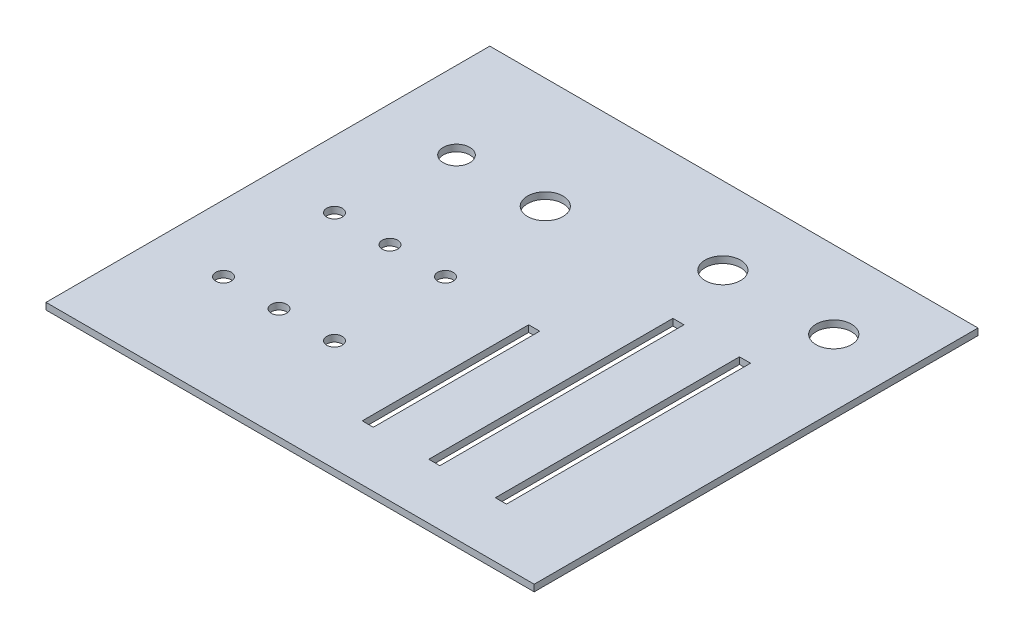
ISO-10303-21;
HEADER;
FILE_DESCRIPTION(('STEP AP214'),'2;1');
FILE_NAME('part.step','',(''),(''),'','','');
FILE_SCHEMA(('AUTOMOTIVE_DESIGN { 1 0 10303 214 1 1 1 1 }'));
ENDSEC;
DATA;
#1=APPLICATION_CONTEXT('core data for automotive mechanical design processes');
#2=APPLICATION_PROTOCOL_DEFINITION('international standard','automotive_design',2000,#1);
#3=PRODUCT_CONTEXT('',#1,'mechanical');
#4=PRODUCT('Part','Part','',(#3));
#5=PRODUCT_RELATED_PRODUCT_CATEGORY('part','',(#4));
#6=PRODUCT_DEFINITION_FORMATION('','',#4);
#7=PRODUCT_DEFINITION_CONTEXT('part definition',#1,'design');
#8=PRODUCT_DEFINITION('design','',#6,#7);
#9=PRODUCT_DEFINITION_SHAPE('','',#8);
#10=(LENGTH_UNIT() NAMED_UNIT(*) SI_UNIT(.MILLI.,.METRE.));
#11=(NAMED_UNIT(*) PLANE_ANGLE_UNIT() SI_UNIT($,.RADIAN.));
#12=(NAMED_UNIT(*) SI_UNIT($,.STERADIAN.) SOLID_ANGLE_UNIT());
#13=UNCERTAINTY_MEASURE_WITH_UNIT(LENGTH_MEASURE(1.E-05),#10,'distance_accuracy_value','');
#14=(GEOMETRIC_REPRESENTATION_CONTEXT(3) GLOBAL_UNCERTAINTY_ASSIGNED_CONTEXT((#13)) GLOBAL_UNIT_ASSIGNED_CONTEXT((#10,
#11,#12)) REPRESENTATION_CONTEXT('',''));
#15=CARTESIAN_POINT('',(0.,0.,0.));
#16=DIRECTION('',(0.,0.,1.));
#17=DIRECTION('',(1.,0.,0.));
#18=AXIS2_PLACEMENT_3D('',#15,#16,#17);
#19=CARTESIAN_POINT('',(-110.,3.,-100.));
#20=DIRECTION('',(1.,0.,0.));
#21=DIRECTION('',(0.,0.,-1.));
#22=AXIS2_PLACEMENT_3D('',#19,#20,#21);
#23=PLANE('',#22);
#24=DIRECTION('',(0.,0.,1.));
#25=VECTOR('',#24,1.);
#26=CARTESIAN_POINT('',(-110.,0.,-100.));
#27=LINE('',#26,#25);
#28=CARTESIAN_POINT('',(-110.,0.,-100.));
#29=VERTEX_POINT('',#28);
#30=CARTESIAN_POINT('',(-110.,0.,100.));
#31=VERTEX_POINT('',#30);
#32=EDGE_CURVE('E302',#29,#31,#27,.T.);
#33=ORIENTED_EDGE('',*,*,#32,.T.);
#34=DIRECTION('',(0.,-1.,0.));
#35=VECTOR('',#34,1.);
#36=CARTESIAN_POINT('',(-110.,3.,100.));
#37=LINE('',#36,#35);
#38=CARTESIAN_POINT('',(-110.,3.,100.));
#39=VERTEX_POINT('',#38);
#40=EDGE_CURVE('E11',#39,#31,#37,.T.);
#41=ORIENTED_EDGE('',*,*,#40,.F.);
#42=DIRECTION('',(0.,0.,1.));
#43=VECTOR('',#42,1.);
#44=CARTESIAN_POINT('',(-110.,3.,-100.));
#45=LINE('',#44,#43);
#46=CARTESIAN_POINT('',(-110.,3.,-100.));
#47=VERTEX_POINT('',#46);
#48=EDGE_CURVE('E305',#47,#39,#45,.T.);
#49=ORIENTED_EDGE('',*,*,#48,.F.);
#50=DIRECTION('',(0.,-1.,0.));
#51=VECTOR('',#50,1.);
#52=CARTESIAN_POINT('',(-110.,3.,-100.));
#53=LINE('',#52,#51);
#54=EDGE_CURVE('E315',#47,#29,#53,.T.);
#55=ORIENTED_EDGE('',*,*,#54,.T.);
#56=EDGE_LOOP('',(#33,#41,#49,#55));
#57=FACE_BOUND('',#56,.T.);
#58=ADVANCED_FACE('F33',(#57),#23,.F.);
#59=CARTESIAN_POINT('',(110.,3.,100.));
#60=DIRECTION('',(0.,0.,-1.));
#61=DIRECTION('',(-1.,0.,0.));
#62=AXIS2_PLACEMENT_3D('',#59,#60,#61);
#63=PLANE('',#62);
#64=DIRECTION('',(1.,0.,0.));
#65=VECTOR('',#64,1.);
#66=CARTESIAN_POINT('',(110.,0.,100.));
#67=LINE('',#66,#65);
#68=CARTESIAN_POINT('',(110.,0.,100.));
#69=VERTEX_POINT('',#68);
#70=EDGE_CURVE('E318',#31,#69,#67,.T.);
#71=ORIENTED_EDGE('',*,*,#70,.T.);
#72=DIRECTION('',(0.,-1.,0.));
#73=VECTOR('',#72,1.);
#74=CARTESIAN_POINT('',(110.,3.,100.));
#75=LINE('',#74,#73);
#76=CARTESIAN_POINT('',(110.,3.,100.));
#77=VERTEX_POINT('',#76);
#78=EDGE_CURVE('E40',#77,#69,#75,.T.);
#79=ORIENTED_EDGE('',*,*,#78,.F.);
#80=DIRECTION('',(1.,0.,0.));
#81=VECTOR('',#80,1.);
#82=CARTESIAN_POINT('',(110.,3.,100.));
#83=LINE('',#82,#81);
#84=EDGE_CURVE('E308',#39,#77,#83,.T.);
#85=ORIENTED_EDGE('',*,*,#84,.F.);
#86=ORIENTED_EDGE('',*,*,#40,.T.);
#87=EDGE_LOOP('',(#71,#79,#85,#86));
#88=FACE_BOUND('',#87,.T.);
#89=ADVANCED_FACE('F347',(#88),#63,.F.);
#90=CARTESIAN_POINT('',(110.,3.,-100.));
#91=DIRECTION('',(-1.,0.,0.));
#92=DIRECTION('',(0.,0.,1.));
#93=AXIS2_PLACEMENT_3D('',#90,#91,#92);
#94=PLANE('',#93);
#95=DIRECTION('',(0.,0.,-1.));
#96=VECTOR('',#95,1.);
#97=CARTESIAN_POINT('',(110.,0.,-100.));
#98=LINE('',#97,#96);
#99=CARTESIAN_POINT('',(110.,0.,-100.));
#100=VERTEX_POINT('',#99);
#101=EDGE_CURVE('E320',#69,#100,#98,.T.);
#102=ORIENTED_EDGE('',*,*,#101,.T.);
#103=DIRECTION('',(0.,-1.,0.));
#104=VECTOR('',#103,1.);
#105=CARTESIAN_POINT('',(110.,3.,-100.));
#106=LINE('',#105,#104);
#107=CARTESIAN_POINT('',(110.,3.,-100.));
#108=VERTEX_POINT('',#107);
#109=EDGE_CURVE('E325',#108,#100,#106,.T.);
#110=ORIENTED_EDGE('',*,*,#109,.F.);
#111=DIRECTION('',(0.,0.,-1.));
#112=VECTOR('',#111,1.);
#113=CARTESIAN_POINT('',(110.,3.,-100.));
#114=LINE('',#113,#112);
#115=EDGE_CURVE('E311',#77,#108,#114,.T.);
#116=ORIENTED_EDGE('',*,*,#115,.F.);
#117=ORIENTED_EDGE('',*,*,#78,.T.);
#118=EDGE_LOOP('',(#102,#110,#116,#117));
#119=FACE_BOUND('',#118,.T.);
#120=ADVANCED_FACE('F332',(#119),#94,.F.);
#121=CARTESIAN_POINT('',(110.,3.,-100.));
#122=DIRECTION('',(0.,0.,1.));
#123=DIRECTION('',(1.,0.,0.));
#124=AXIS2_PLACEMENT_3D('',#121,#122,#123);
#125=PLANE('',#124);
#126=DIRECTION('',(-1.,0.,0.));
#127=VECTOR('',#126,1.);
#128=CARTESIAN_POINT('',(110.,0.,-100.));
#129=LINE('',#128,#127);
#130=EDGE_CURVE('E309',#100,#29,#129,.T.);
#131=ORIENTED_EDGE('',*,*,#130,.T.);
#132=ORIENTED_EDGE('',*,*,#54,.F.);
#133=DIRECTION('',(-1.,0.,0.));
#134=VECTOR('',#133,1.);
#135=CARTESIAN_POINT('',(110.,3.,-100.));
#136=LINE('',#135,#134);
#137=EDGE_CURVE('E313',#108,#47,#136,.T.);
#138=ORIENTED_EDGE('',*,*,#137,.F.);
#139=ORIENTED_EDGE('',*,*,#109,.T.);
#140=EDGE_LOOP('',(#131,#132,#138,#139));
#141=FACE_BOUND('',#140,.T.);
#142=ADVANCED_FACE('F340',(#141),#125,.F.);
#143=CARTESIAN_POINT('',(0.,3.,0.));
#144=DIRECTION('',(0.,-1.,0.));
#145=DIRECTION('',(0.,0.,-1.));
#146=AXIS2_PLACEMENT_3D('',#143,#144,#145);
#147=PLANE('',#146);
#148=CARTESIAN_POINT('',(-29.9999999999999,3.,50.));
#149=DIRECTION('',(0.,1.,0.));
#150=DIRECTION('',(0.,0.,1.));
#151=AXIS2_PLACEMENT_3D('',#148,#149,#150);
#152=CIRCLE('',#151,3.5);
#153=CARTESIAN_POINT('',(-29.9999999999999,3.,53.5));
#154=VERTEX_POINT('',#153);
#155=EDGE_CURVE('E267',#154,#154,#152,.T.);
#156=ORIENTED_EDGE('',*,*,#155,.F.);
#157=EDGE_LOOP('',(#156));
#158=FACE_BOUND('',#157,.T.);
#159=CARTESIAN_POINT('',(-75.,3.,-50.));
#160=DIRECTION('',(0.,1.,0.));
#161=DIRECTION('',(0.,0.,1.));
#162=AXIS2_PLACEMENT_3D('',#159,#160,#161);
#163=CIRCLE('',#162,6.);
#164=CARTESIAN_POINT('',(-75.,3.,-44.));
#165=VERTEX_POINT('',#164);
#166=EDGE_CURVE('E252',#165,#165,#163,.T.);
#167=ORIENTED_EDGE('',*,*,#166,.F.);
#168=EDGE_LOOP('',(#167));
#169=FACE_BOUND('',#168,.T.);
#170=CARTESIAN_POINT('',(-35.,3.,-50.));
#171=DIRECTION('',(0.,1.,0.));
#172=DIRECTION('',(0.,0.,1.));
#173=AXIS2_PLACEMENT_3D('',#170,#171,#172);
#174=CIRCLE('',#173,8.);
#175=CARTESIAN_POINT('',(-35.,3.,-42.));
#176=VERTEX_POINT('',#175);
#177=EDGE_CURVE('E253',#176,#176,#174,.T.);
#178=ORIENTED_EDGE('',*,*,#177,.F.);
#179=EDGE_LOOP('',(#178));
#180=FACE_BOUND('',#179,.T.);
#181=CARTESIAN_POINT('',(29.9999999999999,3.,-65.));
#182=DIRECTION('',(0.,1.,0.));
#183=DIRECTION('',(0.,0.,1.));
#184=AXIS2_PLACEMENT_3D('',#181,#182,#183);
#185=CIRCLE('',#184,8.);
#186=CARTESIAN_POINT('',(29.9999999999999,3.,-57.));
#187=VERTEX_POINT('',#186);
#188=EDGE_CURVE('E259',#187,#187,#185,.T.);
#189=ORIENTED_EDGE('',*,*,#188,.F.);
#190=EDGE_LOOP('',(#189));
#191=FACE_BOUND('',#190,.T.);
#192=CARTESIAN_POINT('',(-55.,3.,50.));
#193=DIRECTION('',(0.,1.,0.));
#194=DIRECTION('',(0.,0.,1.));
#195=AXIS2_PLACEMENT_3D('',#192,#193,#194);
#196=CIRCLE('',#195,3.5);
#197=CARTESIAN_POINT('',(-55.,3.,53.5));
#198=VERTEX_POINT('',#197);
#199=EDGE_CURVE('E266',#198,#198,#196,.T.);
#200=ORIENTED_EDGE('',*,*,#199,.F.);
#201=EDGE_LOOP('',(#200));
#202=FACE_BOUND('',#201,.T.);
#203=CARTESIAN_POINT('',(-79.9999999999999,3.,50.));
#204=DIRECTION('',(0.,1.,0.));
#205=DIRECTION('',(0.,0.,1.));
#206=AXIS2_PLACEMENT_3D('',#203,#204,#205);
#207=CIRCLE('',#206,3.50000000000001);
#208=CARTESIAN_POINT('',(-79.9999999999999,3.,53.5));
#209=VERTEX_POINT('',#208);
#210=EDGE_CURVE('E291',#209,#209,#207,.T.);
#211=ORIENTED_EDGE('',*,*,#210,.F.);
#212=EDGE_LOOP('',(#211));
#213=FACE_BOUND('',#212,.T.);
#214=CARTESIAN_POINT('',(-30.,3.,0.));
#215=DIRECTION('',(0.,1.,0.));
#216=DIRECTION('',(0.,0.,1.));
#217=AXIS2_PLACEMENT_3D('',#214,#215,#216);
#218=CIRCLE('',#217,3.5);
#219=CARTESIAN_POINT('',(-30.,3.,3.5));
#220=VERTEX_POINT('',#219);
#221=EDGE_CURVE('E285',#220,#220,#218,.T.);
#222=ORIENTED_EDGE('',*,*,#221,.F.);
#223=EDGE_LOOP('',(#222));
#224=FACE_BOUND('',#223,.T.);
#225=CARTESIAN_POINT('',(-55.,3.,0.));
#226=DIRECTION('',(0.,1.,0.));
#227=DIRECTION('',(0.,0.,1.));
#228=AXIS2_PLACEMENT_3D('',#225,#226,#227);
#229=CIRCLE('',#228,3.5);
#230=CARTESIAN_POINT('',(-55.,3.,3.50000000000001));
#231=VERTEX_POINT('',#230);
#232=EDGE_CURVE('E279',#231,#231,#229,.T.);
#233=ORIENTED_EDGE('',*,*,#232,.F.);
#234=EDGE_LOOP('',(#233));
#235=FACE_BOUND('',#234,.T.);
#236=CARTESIAN_POINT('',(79.9999999999999,3.,-65.));
#237=DIRECTION('',(0.,1.,0.));
#238=DIRECTION('',(0.,0.,1.));
#239=AXIS2_PLACEMENT_3D('',#236,#237,#238);
#240=CIRCLE('',#239,7.99999999999999);
#241=CARTESIAN_POINT('',(79.9999999999999,3.,-57.));
#242=VERTEX_POINT('',#241);
#243=EDGE_CURVE('E172',#242,#242,#240,.T.);
#244=ORIENTED_EDGE('',*,*,#243,.F.);
#245=EDGE_LOOP('',(#244));
#246=FACE_BOUND('',#245,.T.);
#247=DIRECTION('',(-1.,0.,0.));
#248=VECTOR('',#247,1.);
#249=CARTESIAN_POINT('',(67.4999999999999,3.,-35.));
#250=LINE('',#249,#248);
#251=CARTESIAN_POINT('',(72.5,3.,-35.));
#252=VERTEX_POINT('',#251);
#253=CARTESIAN_POINT('',(67.4999999999999,3.,-35.));
#254=VERTEX_POINT('',#253);
#255=EDGE_CURVE('E178',#252,#254,#250,.T.);
#256=ORIENTED_EDGE('',*,*,#255,.F.);
#257=DIRECTION('',(0.,0.,-1.));
#258=VECTOR('',#257,1.);
#259=CARTESIAN_POINT('',(72.5,3.,-35.));
#260=LINE('',#259,#258);
#261=CARTESIAN_POINT('',(72.5,3.,75.));
#262=VERTEX_POINT('',#261);
#263=EDGE_CURVE('E47',#262,#252,#260,.T.);
#264=ORIENTED_EDGE('',*,*,#263,.F.);
#265=DIRECTION('',(1.,0.,0.));
#266=VECTOR('',#265,1.);
#267=CARTESIAN_POINT('',(67.5,3.,75.));
#268=LINE('',#267,#266);
#269=CARTESIAN_POINT('',(67.5,3.,75.));
#270=VERTEX_POINT('',#269);
#271=EDGE_CURVE('E166',#270,#262,#268,.T.);
#272=ORIENTED_EDGE('',*,*,#271,.F.);
#273=DIRECTION('',(0.,0.,1.));
#274=VECTOR('',#273,1.);
#275=CARTESIAN_POINT('',(67.4999999999999,3.,-35.));
#276=LINE('',#275,#274);
#277=EDGE_CURVE('E169',#254,#270,#276,.T.);
#278=ORIENTED_EDGE('',*,*,#277,.F.);
#279=EDGE_LOOP('',(#256,#264,#272,#278));
#280=FACE_BOUND('',#279,.T.);
#281=DIRECTION('',(-1.,0.,0.));
#282=VECTOR('',#281,1.);
#283=CARTESIAN_POINT('',(37.5,3.,-35.));
#284=LINE('',#283,#282);
#285=CARTESIAN_POINT('',(42.5,3.,-35.));
#286=VERTEX_POINT('',#285);
#287=CARTESIAN_POINT('',(37.5,3.,-35.));
#288=VERTEX_POINT('',#287);
#289=EDGE_CURVE('E203',#286,#288,#284,.T.);
#290=ORIENTED_EDGE('',*,*,#289,.F.);
#291=DIRECTION('',(0.,0.,-1.));
#292=VECTOR('',#291,1.);
#293=CARTESIAN_POINT('',(42.5,3.,-35.));
#294=LINE('',#293,#292);
#295=CARTESIAN_POINT('',(42.5,3.,75.));
#296=VERTEX_POINT('',#295);
#297=EDGE_CURVE('E55',#296,#286,#294,.T.);
#298=ORIENTED_EDGE('',*,*,#297,.F.);
#299=DIRECTION('',(1.,0.,0.));
#300=VECTOR('',#299,1.);
#301=CARTESIAN_POINT('',(37.5,3.,75.));
#302=LINE('',#301,#300);
#303=CARTESIAN_POINT('',(37.5,3.,75.));
#304=VERTEX_POINT('',#303);
#305=EDGE_CURVE('E192',#304,#296,#302,.T.);
#306=ORIENTED_EDGE('',*,*,#305,.F.);
#307=DIRECTION('',(0.,0.,1.));
#308=VECTOR('',#307,1.);
#309=CARTESIAN_POINT('',(37.5,3.,-35.));
#310=LINE('',#309,#308);
#311=EDGE_CURVE('E207',#288,#304,#310,.T.);
#312=ORIENTED_EDGE('',*,*,#311,.F.);
#313=EDGE_LOOP('',(#290,#298,#306,#312));
#314=FACE_BOUND('',#313,.T.);
#315=DIRECTION('',(-1.,0.,0.));
#316=VECTOR('',#315,1.);
#317=CARTESIAN_POINT('',(7.49999999999997,3.,0.));
#318=LINE('',#317,#316);
#319=CARTESIAN_POINT('',(12.5,3.,0.));
#320=VERTEX_POINT('',#319);
#321=CARTESIAN_POINT('',(7.49999999999997,3.,0.));
#322=VERTEX_POINT('',#321);
#323=EDGE_CURVE('E234',#320,#322,#318,.T.);
#324=ORIENTED_EDGE('',*,*,#323,.F.);
#325=DIRECTION('',(0.,0.,-1.));
#326=VECTOR('',#325,1.);
#327=CARTESIAN_POINT('',(12.5,3.,75.));
#328=LINE('',#327,#326);
#329=CARTESIAN_POINT('',(12.5,3.,75.));
#330=VERTEX_POINT('',#329);
#331=EDGE_CURVE('E232',#330,#320,#328,.T.);
#332=ORIENTED_EDGE('',*,*,#331,.F.);
#333=DIRECTION('',(1.,0.,0.));
#334=VECTOR('',#333,1.);
#335=CARTESIAN_POINT('',(7.49999999999997,3.,75.));
#336=LINE('',#335,#334);
#337=CARTESIAN_POINT('',(7.49999999999997,3.,75.));
#338=VERTEX_POINT('',#337);
#339=EDGE_CURVE('E222',#338,#330,#336,.T.);
#340=ORIENTED_EDGE('',*,*,#339,.F.);
#341=DIRECTION('',(0.,0.,1.));
#342=VECTOR('',#341,1.);
#343=CARTESIAN_POINT('',(7.49999999999997,3.,75.));
#344=LINE('',#343,#342);
#345=EDGE_CURVE('E237',#322,#338,#344,.T.);
#346=ORIENTED_EDGE('',*,*,#345,.F.);
#347=EDGE_LOOP('',(#324,#332,#340,#346));
#348=FACE_BOUND('',#347,.T.);
#349=CARTESIAN_POINT('',(-80.,3.,0.));
#350=DIRECTION('',(0.,1.,0.));
#351=DIRECTION('',(0.,0.,1.));
#352=AXIS2_PLACEMENT_3D('',#349,#350,#351);
#353=CIRCLE('',#352,3.50000000000001);
#354=CARTESIAN_POINT('',(-80.,3.,3.50000000000002));
#355=VERTEX_POINT('',#354);
#356=EDGE_CURVE('E278',#355,#355,#353,.T.);
#357=ORIENTED_EDGE('',*,*,#356,.F.);
#358=EDGE_LOOP('',(#357));
#359=FACE_BOUND('',#358,.T.);
#360=ORIENTED_EDGE('',*,*,#48,.T.);
#361=ORIENTED_EDGE('',*,*,#84,.T.);
#362=ORIENTED_EDGE('',*,*,#115,.T.);
#363=ORIENTED_EDGE('',*,*,#137,.T.);
#364=EDGE_LOOP('',(#360,#361,#362,#363));
#365=FACE_BOUND('',#364,.T.);
#366=ADVANCED_FACE('F346',(#158,#169,#180,#191,#202,#213,#224,#235,#246,#280,#314,#348,#359,
#365),#147,.F.);
#367=CARTESIAN_POINT('',(0.,0.,0.));
#368=DIRECTION('',(0.,-1.,0.));
#369=DIRECTION('',(0.,0.,-1.));
#370=AXIS2_PLACEMENT_3D('',#367,#368,#369);
#371=PLANE('',#370);
#372=CARTESIAN_POINT('',(-29.9999999999999,0.,50.));
#373=DIRECTION('',(0.,1.,0.));
#374=DIRECTION('',(0.,0.,1.));
#375=AXIS2_PLACEMENT_3D('',#372,#373,#374);
#376=CIRCLE('',#375,3.5);
#377=CARTESIAN_POINT('',(-29.9999999999999,0.,53.5));
#378=VERTEX_POINT('',#377);
#379=EDGE_CURVE('E263',#378,#378,#376,.T.);
#380=ORIENTED_EDGE('',*,*,#379,.T.);
#381=EDGE_LOOP('',(#380));
#382=FACE_BOUND('',#381,.T.);
#383=CARTESIAN_POINT('',(-75.,0.,-50.));
#384=DIRECTION('',(0.,1.,0.));
#385=DIRECTION('',(0.,0.,1.));
#386=AXIS2_PLACEMENT_3D('',#383,#384,#385);
#387=CIRCLE('',#386,6.);
#388=CARTESIAN_POINT('',(-75.,0.,-44.));
#389=VERTEX_POINT('',#388);
#390=EDGE_CURVE('E270',#389,#389,#387,.T.);
#391=ORIENTED_EDGE('',*,*,#390,.T.);
#392=EDGE_LOOP('',(#391));
#393=FACE_BOUND('',#392,.T.);
#394=CARTESIAN_POINT('',(-35.,0.,-50.));
#395=DIRECTION('',(0.,1.,0.));
#396=DIRECTION('',(0.,0.,1.));
#397=AXIS2_PLACEMENT_3D('',#394,#395,#396);
#398=CIRCLE('',#397,8.);
#399=CARTESIAN_POINT('',(-35.,0.,-42.));
#400=VERTEX_POINT('',#399);
#401=EDGE_CURVE('E249',#400,#400,#398,.T.);
#402=ORIENTED_EDGE('',*,*,#401,.T.);
#403=EDGE_LOOP('',(#402));
#404=FACE_BOUND('',#403,.T.);
#405=CARTESIAN_POINT('',(29.9999999999999,0.,-65.));
#406=DIRECTION('',(0.,1.,0.));
#407=DIRECTION('',(0.,0.,1.));
#408=AXIS2_PLACEMENT_3D('',#405,#406,#407);
#409=CIRCLE('',#408,8.);
#410=CARTESIAN_POINT('',(29.9999999999999,0.,-57.));
#411=VERTEX_POINT('',#410);
#412=EDGE_CURVE('E256',#411,#411,#409,.T.);
#413=ORIENTED_EDGE('',*,*,#412,.T.);
#414=EDGE_LOOP('',(#413));
#415=FACE_BOUND('',#414,.T.);
#416=CARTESIAN_POINT('',(-55.,0.,50.));
#417=DIRECTION('',(0.,1.,0.));
#418=DIRECTION('',(0.,0.,1.));
#419=AXIS2_PLACEMENT_3D('',#416,#417,#418);
#420=CIRCLE('',#419,3.5);
#421=CARTESIAN_POINT('',(-55.,0.,53.5));
#422=VERTEX_POINT('',#421);
#423=EDGE_CURVE('E294',#422,#422,#420,.T.);
#424=ORIENTED_EDGE('',*,*,#423,.T.);
#425=EDGE_LOOP('',(#424));
#426=FACE_BOUND('',#425,.T.);
#427=CARTESIAN_POINT('',(-79.9999999999999,0.,50.));
#428=DIRECTION('',(0.,1.,0.));
#429=DIRECTION('',(0.,0.,1.));
#430=AXIS2_PLACEMENT_3D('',#427,#428,#429);
#431=CIRCLE('',#430,3.50000000000001);
#432=CARTESIAN_POINT('',(-79.9999999999999,0.,53.5));
#433=VERTEX_POINT('',#432);
#434=EDGE_CURVE('E288',#433,#433,#431,.T.);
#435=ORIENTED_EDGE('',*,*,#434,.T.);
#436=EDGE_LOOP('',(#435));
#437=FACE_BOUND('',#436,.T.);
#438=CARTESIAN_POINT('',(-30.,0.,0.));
#439=DIRECTION('',(0.,1.,0.));
#440=DIRECTION('',(0.,0.,1.));
#441=AXIS2_PLACEMENT_3D('',#438,#439,#440);
#442=CIRCLE('',#441,3.5);
#443=CARTESIAN_POINT('',(-30.,0.,3.5));
#444=VERTEX_POINT('',#443);
#445=EDGE_CURVE('E282',#444,#444,#442,.T.);
#446=ORIENTED_EDGE('',*,*,#445,.T.);
#447=EDGE_LOOP('',(#446));
#448=FACE_BOUND('',#447,.T.);
#449=CARTESIAN_POINT('',(-55.,0.,0.));
#450=DIRECTION('',(0.,1.,0.));
#451=DIRECTION('',(0.,0.,1.));
#452=AXIS2_PLACEMENT_3D('',#449,#450,#451);
#453=CIRCLE('',#452,3.5);
#454=CARTESIAN_POINT('',(-55.,0.,3.50000000000001));
#455=VERTEX_POINT('',#454);
#456=EDGE_CURVE('E275',#455,#455,#453,.T.);
#457=ORIENTED_EDGE('',*,*,#456,.T.);
#458=EDGE_LOOP('',(#457));
#459=FACE_BOUND('',#458,.T.);
#460=CARTESIAN_POINT('',(79.9999999999999,0.,-65.));
#461=DIRECTION('',(0.,1.,0.));
#462=DIRECTION('',(0.,0.,1.));
#463=AXIS2_PLACEMENT_3D('',#460,#461,#462);
#464=CIRCLE('',#463,7.99999999999999);
#465=CARTESIAN_POINT('',(79.9999999999999,0.,-57.));
#466=VERTEX_POINT('',#465);
#467=EDGE_CURVE('E262',#466,#466,#464,.T.);
#468=ORIENTED_EDGE('',*,*,#467,.T.);
#469=EDGE_LOOP('',(#468));
#470=FACE_BOUND('',#469,.T.);
#471=DIRECTION('',(0.,0.,-1.));
#472=VECTOR('',#471,1.);
#473=CARTESIAN_POINT('',(72.5,0.,-35.));
#474=LINE('',#473,#472);
#475=CARTESIAN_POINT('',(72.5,0.,75.));
#476=VERTEX_POINT('',#475);
#477=CARTESIAN_POINT('',(72.5,0.,-35.));
#478=VERTEX_POINT('',#477);
#479=EDGE_CURVE('E147',#476,#478,#474,.T.);
#480=ORIENTED_EDGE('',*,*,#479,.T.);
#481=DIRECTION('',(-1.,0.,0.));
#482=VECTOR('',#481,1.);
#483=CARTESIAN_POINT('',(67.4999999999999,0.,-35.));
#484=LINE('',#483,#482);
#485=CARTESIAN_POINT('',(67.4999999999999,0.,-35.));
#486=VERTEX_POINT('',#485);
#487=EDGE_CURVE('E157',#478,#486,#484,.T.);
#488=ORIENTED_EDGE('',*,*,#487,.T.);
#489=DIRECTION('',(0.,0.,1.));
#490=VECTOR('',#489,1.);
#491=CARTESIAN_POINT('',(67.4999999999999,0.,-35.));
#492=LINE('',#491,#490);
#493=CARTESIAN_POINT('',(67.5,0.,75.));
#494=VERTEX_POINT('',#493);
#495=EDGE_CURVE('E161',#486,#494,#492,.T.);
#496=ORIENTED_EDGE('',*,*,#495,.T.);
#497=DIRECTION('',(1.,0.,0.));
#498=VECTOR('',#497,1.);
#499=CARTESIAN_POINT('',(67.5,0.,75.));
#500=LINE('',#499,#498);
#501=EDGE_CURVE('E153',#494,#476,#500,.T.);
#502=ORIENTED_EDGE('',*,*,#501,.T.);
#503=EDGE_LOOP('',(#480,#488,#496,#502));
#504=FACE_BOUND('',#503,.T.);
#505=DIRECTION('',(0.,0.,-1.));
#506=VECTOR('',#505,1.);
#507=CARTESIAN_POINT('',(42.5,0.,-35.));
#508=LINE('',#507,#506);
#509=CARTESIAN_POINT('',(42.5,0.,75.));
#510=VERTEX_POINT('',#509);
#511=CARTESIAN_POINT('',(42.5,0.,-35.));
#512=VERTEX_POINT('',#511);
#513=EDGE_CURVE('E188',#510,#512,#508,.T.);
#514=ORIENTED_EDGE('',*,*,#513,.T.);
#515=DIRECTION('',(-1.,0.,0.));
#516=VECTOR('',#515,1.);
#517=CARTESIAN_POINT('',(37.5,0.,-35.));
#518=LINE('',#517,#516);
#519=CARTESIAN_POINT('',(37.5,0.,-35.));
#520=VERTEX_POINT('',#519);
#521=EDGE_CURVE('E191',#512,#520,#518,.T.);
#522=ORIENTED_EDGE('',*,*,#521,.T.);
#523=DIRECTION('',(0.,0.,1.));
#524=VECTOR('',#523,1.);
#525=CARTESIAN_POINT('',(37.5,0.,-35.));
#526=LINE('',#525,#524);
#527=CARTESIAN_POINT('',(37.5,0.,75.));
#528=VERTEX_POINT('',#527);
#529=EDGE_CURVE('E195',#520,#528,#526,.T.);
#530=ORIENTED_EDGE('',*,*,#529,.T.);
#531=DIRECTION('',(1.,0.,0.));
#532=VECTOR('',#531,1.);
#533=CARTESIAN_POINT('',(37.5,0.,75.));
#534=LINE('',#533,#532);
#535=EDGE_CURVE('E198',#528,#510,#534,.T.);
#536=ORIENTED_EDGE('',*,*,#535,.T.);
#537=EDGE_LOOP('',(#514,#522,#530,#536));
#538=FACE_BOUND('',#537,.T.);
#539=DIRECTION('',(0.,0.,-1.));
#540=VECTOR('',#539,1.);
#541=CARTESIAN_POINT('',(12.5,0.,75.));
#542=LINE('',#541,#540);
#543=CARTESIAN_POINT('',(12.5,0.,75.));
#544=VERTEX_POINT('',#543);
#545=CARTESIAN_POINT('',(12.5,0.,0.));
#546=VERTEX_POINT('',#545);
#547=EDGE_CURVE('E218',#544,#546,#542,.T.);
#548=ORIENTED_EDGE('',*,*,#547,.T.);
#549=DIRECTION('',(-1.,0.,0.));
#550=VECTOR('',#549,1.);
#551=CARTESIAN_POINT('',(7.49999999999997,0.,0.));
#552=LINE('',#551,#550);
#553=CARTESIAN_POINT('',(7.49999999999997,0.,0.));
#554=VERTEX_POINT('',#553);
#555=EDGE_CURVE('E221',#546,#554,#552,.T.);
#556=ORIENTED_EDGE('',*,*,#555,.T.);
#557=DIRECTION('',(0.,0.,1.));
#558=VECTOR('',#557,1.);
#559=CARTESIAN_POINT('',(7.49999999999997,0.,75.));
#560=LINE('',#559,#558);
#561=CARTESIAN_POINT('',(7.49999999999997,0.,75.));
#562=VERTEX_POINT('',#561);
#563=EDGE_CURVE('E225',#554,#562,#560,.T.);
#564=ORIENTED_EDGE('',*,*,#563,.T.);
#565=DIRECTION('',(1.,0.,0.));
#566=VECTOR('',#565,1.);
#567=CARTESIAN_POINT('',(7.49999999999997,0.,75.));
#568=LINE('',#567,#566);
#569=EDGE_CURVE('E228',#562,#544,#568,.T.);
#570=ORIENTED_EDGE('',*,*,#569,.T.);
#571=EDGE_LOOP('',(#548,#556,#564,#570));
#572=FACE_BOUND('',#571,.T.);
#573=CARTESIAN_POINT('',(-80.,0.,0.));
#574=DIRECTION('',(0.,1.,0.));
#575=DIRECTION('',(0.,0.,1.));
#576=AXIS2_PLACEMENT_3D('',#573,#574,#575);
#577=CIRCLE('',#576,3.50000000000001);
#578=CARTESIAN_POINT('',(-80.,0.,3.50000000000002));
#579=VERTEX_POINT('',#578);
#580=EDGE_CURVE('E299',#579,#579,#577,.T.);
#581=ORIENTED_EDGE('',*,*,#580,.T.);
#582=EDGE_LOOP('',(#581));
#583=FACE_BOUND('',#582,.T.);
#584=ORIENTED_EDGE('',*,*,#32,.F.);
#585=ORIENTED_EDGE('',*,*,#130,.F.);
#586=ORIENTED_EDGE('',*,*,#101,.F.);
#587=ORIENTED_EDGE('',*,*,#70,.F.);
#588=EDGE_LOOP('',(#584,#585,#586,#587));
#589=FACE_BOUND('',#588,.T.);
#590=ADVANCED_FACE('F163',(#382,#393,#404,#415,#426,#437,#448,#459,#470,#504,#538,#572,#583,
#589),#371,.T.);
#591=CARTESIAN_POINT('',(-80.,0.,0.));
#592=DIRECTION('',(0.,1.,0.));
#593=DIRECTION('',(0.,0.,1.));
#594=AXIS2_PLACEMENT_3D('',#591,#592,#593);
#595=CYLINDRICAL_SURFACE('',#594,3.50000000000001);
#596=ORIENTED_EDGE('',*,*,#580,.F.);
#597=EDGE_LOOP('',(#596));
#598=FACE_BOUND('',#597,.T.);
#599=ORIENTED_EDGE('',*,*,#356,.T.);
#600=EDGE_LOOP('',(#599));
#601=FACE_BOUND('',#600,.T.);
#602=ADVANCED_FACE('F359',(#598,#601),#595,.F.);
#603=CARTESIAN_POINT('',(12.5,0.,75.));
#604=DIRECTION('',(1.,0.,0.));
#605=DIRECTION('',(0.,0.,-1.));
#606=AXIS2_PLACEMENT_3D('',#603,#604,#605);
#607=PLANE('',#606);
#608=ORIENTED_EDGE('',*,*,#331,.T.);
#609=DIRECTION('',(0.,1.,0.));
#610=VECTOR('',#609,1.);
#611=CARTESIAN_POINT('',(12.5,0.,0.));
#612=LINE('',#611,#610);
#613=EDGE_CURVE('E231',#546,#320,#612,.T.);
#614=ORIENTED_EDGE('',*,*,#613,.F.);
#615=ORIENTED_EDGE('',*,*,#547,.F.);
#616=DIRECTION('',(0.,1.,0.));
#617=VECTOR('',#616,1.);
#618=CARTESIAN_POINT('',(12.5,0.,75.));
#619=LINE('',#618,#617);
#620=EDGE_CURVE('E204',#544,#330,#619,.T.);
#621=ORIENTED_EDGE('',*,*,#620,.T.);
#622=EDGE_LOOP('',(#608,#614,#615,#621));
#623=FACE_BOUND('',#622,.T.);
#624=ADVANCED_FACE('F366',(#623),#607,.F.);
#625=CARTESIAN_POINT('',(7.49999999999997,0.,75.));
#626=DIRECTION('',(0.,0.,1.));
#627=DIRECTION('',(1.,0.,0.));
#628=AXIS2_PLACEMENT_3D('',#625,#626,#627);
#629=PLANE('',#628);
#630=ORIENTED_EDGE('',*,*,#339,.T.);
#631=ORIENTED_EDGE('',*,*,#620,.F.);
#632=ORIENTED_EDGE('',*,*,#569,.F.);
#633=DIRECTION('',(0.,1.,0.));
#634=VECTOR('',#633,1.);
#635=CARTESIAN_POINT('',(7.49999999999997,0.,75.));
#636=LINE('',#635,#634);
#637=EDGE_CURVE('E243',#562,#338,#636,.T.);
#638=ORIENTED_EDGE('',*,*,#637,.T.);
#639=EDGE_LOOP('',(#630,#631,#632,#638));
#640=FACE_BOUND('',#639,.T.);
#641=ADVANCED_FACE('F403',(#640),#629,.F.);
#642=CARTESIAN_POINT('',(7.49999999999997,0.,75.));
#643=DIRECTION('',(-1.,0.,0.));
#644=DIRECTION('',(0.,0.,1.));
#645=AXIS2_PLACEMENT_3D('',#642,#643,#644);
#646=PLANE('',#645);
#647=ORIENTED_EDGE('',*,*,#345,.T.);
#648=ORIENTED_EDGE('',*,*,#637,.F.);
#649=ORIENTED_EDGE('',*,*,#563,.F.);
#650=DIRECTION('',(0.,1.,0.));
#651=VECTOR('',#650,1.);
#652=CARTESIAN_POINT('',(7.49999999999997,0.,0.));
#653=LINE('',#652,#651);
#654=EDGE_CURVE('E245',#554,#322,#653,.T.);
#655=ORIENTED_EDGE('',*,*,#654,.T.);
#656=EDGE_LOOP('',(#647,#648,#649,#655));
#657=FACE_BOUND('',#656,.T.);
#658=ADVANCED_FACE('F409',(#657),#646,.F.);
#659=CARTESIAN_POINT('',(7.49999999999997,0.,0.));
#660=DIRECTION('',(0.,0.,-1.));
#661=DIRECTION('',(-1.,0.,0.));
#662=AXIS2_PLACEMENT_3D('',#659,#660,#661);
#663=PLANE('',#662);
#664=ORIENTED_EDGE('',*,*,#323,.T.);
#665=ORIENTED_EDGE('',*,*,#654,.F.);
#666=ORIENTED_EDGE('',*,*,#555,.F.);
#667=ORIENTED_EDGE('',*,*,#613,.T.);
#668=EDGE_LOOP('',(#664,#665,#666,#667));
#669=FACE_BOUND('',#668,.T.);
#670=ADVANCED_FACE('F405',(#669),#663,.F.);
#671=CARTESIAN_POINT('',(42.5,0.,-35.));
#672=DIRECTION('',(1.,0.,0.));
#673=DIRECTION('',(0.,0.,-1.));
#674=AXIS2_PLACEMENT_3D('',#671,#672,#673);
#675=PLANE('',#674);
#676=ORIENTED_EDGE('',*,*,#297,.T.);
#677=DIRECTION('',(0.,1.,0.));
#678=VECTOR('',#677,1.);
#679=CARTESIAN_POINT('',(42.5,0.,-35.));
#680=LINE('',#679,#678);
#681=EDGE_CURVE('E201',#512,#286,#680,.T.);
#682=ORIENTED_EDGE('',*,*,#681,.F.);
#683=ORIENTED_EDGE('',*,*,#513,.F.);
#684=DIRECTION('',(0.,1.,0.));
#685=VECTOR('',#684,1.);
#686=CARTESIAN_POINT('',(42.5,0.,75.));
#687=LINE('',#686,#685);
#688=EDGE_CURVE('E179',#510,#296,#687,.T.);
#689=ORIENTED_EDGE('',*,*,#688,.T.);
#690=EDGE_LOOP('',(#676,#682,#683,#689));
#691=FACE_BOUND('',#690,.T.);
#692=ADVANCED_FACE('F408',(#691),#675,.F.);
#693=CARTESIAN_POINT('',(37.5,0.,75.));
#694=DIRECTION('',(0.,0.,1.));
#695=DIRECTION('',(1.,0.,0.));
#696=AXIS2_PLACEMENT_3D('',#693,#694,#695);
#697=PLANE('',#696);
#698=ORIENTED_EDGE('',*,*,#305,.T.);
#699=ORIENTED_EDGE('',*,*,#688,.F.);
#700=ORIENTED_EDGE('',*,*,#535,.F.);
#701=DIRECTION('',(0.,1.,0.));
#702=VECTOR('',#701,1.);
#703=CARTESIAN_POINT('',(37.5,0.,75.));
#704=LINE('',#703,#702);
#705=EDGE_CURVE('E213',#528,#304,#704,.T.);
#706=ORIENTED_EDGE('',*,*,#705,.T.);
#707=EDGE_LOOP('',(#698,#699,#700,#706));
#708=FACE_BOUND('',#707,.T.);
#709=ADVANCED_FACE('F419',(#708),#697,.F.);
#710=CARTESIAN_POINT('',(37.5,0.,-35.));
#711=DIRECTION('',(-1.,0.,0.));
#712=DIRECTION('',(0.,0.,1.));
#713=AXIS2_PLACEMENT_3D('',#710,#711,#712);
#714=PLANE('',#713);
#715=ORIENTED_EDGE('',*,*,#311,.T.);
#716=ORIENTED_EDGE('',*,*,#705,.F.);
#717=ORIENTED_EDGE('',*,*,#529,.F.);
#718=DIRECTION('',(0.,1.,0.));
#719=VECTOR('',#718,1.);
#720=CARTESIAN_POINT('',(37.5,0.,-35.));
#721=LINE('',#720,#719);
#722=EDGE_CURVE('E215',#520,#288,#721,.T.);
#723=ORIENTED_EDGE('',*,*,#722,.T.);
#724=EDGE_LOOP('',(#715,#716,#717,#723));
#725=FACE_BOUND('',#724,.T.);
#726=ADVANCED_FACE('F423',(#725),#714,.F.);
#727=CARTESIAN_POINT('',(37.5,0.,-35.));
#728=DIRECTION('',(0.,0.,-1.));
#729=DIRECTION('',(-1.,0.,0.));
#730=AXIS2_PLACEMENT_3D('',#727,#728,#729);
#731=PLANE('',#730);
#732=ORIENTED_EDGE('',*,*,#289,.T.);
#733=ORIENTED_EDGE('',*,*,#722,.F.);
#734=ORIENTED_EDGE('',*,*,#521,.F.);
#735=ORIENTED_EDGE('',*,*,#681,.T.);
#736=EDGE_LOOP('',(#732,#733,#734,#735));
#737=FACE_BOUND('',#736,.T.);
#738=ADVANCED_FACE('F420',(#737),#731,.F.);
#739=CARTESIAN_POINT('',(72.5,0.,-35.));
#740=DIRECTION('',(1.,0.,0.));
#741=DIRECTION('',(0.,0.,-1.));
#742=AXIS2_PLACEMENT_3D('',#739,#740,#741);
#743=PLANE('',#742);
#744=ORIENTED_EDGE('',*,*,#263,.T.);
#745=DIRECTION('',(0.,1.,0.));
#746=VECTOR('',#745,1.);
#747=CARTESIAN_POINT('',(72.5,0.,-35.));
#748=LINE('',#747,#746);
#749=EDGE_CURVE('E143',#478,#252,#748,.T.);
#750=ORIENTED_EDGE('',*,*,#749,.F.);
#751=ORIENTED_EDGE('',*,*,#479,.F.);
#752=DIRECTION('',(0.,1.,0.));
#753=VECTOR('',#752,1.);
#754=CARTESIAN_POINT('',(72.5,0.,75.));
#755=LINE('',#754,#753);
#756=EDGE_CURVE('E183',#476,#262,#755,.T.);
#757=ORIENTED_EDGE('',*,*,#756,.T.);
#758=EDGE_LOOP('',(#744,#750,#751,#757));
#759=FACE_BOUND('',#758,.T.);
#760=ADVANCED_FACE('F145',(#759),#743,.F.);
#761=CARTESIAN_POINT('',(67.5,0.,75.));
#762=DIRECTION('',(0.,0.,1.));
#763=DIRECTION('',(1.,0.,0.));
#764=AXIS2_PLACEMENT_3D('',#761,#762,#763);
#765=PLANE('',#764);
#766=ORIENTED_EDGE('',*,*,#271,.T.);
#767=ORIENTED_EDGE('',*,*,#756,.F.);
#768=ORIENTED_EDGE('',*,*,#501,.F.);
#769=DIRECTION('',(0.,1.,0.));
#770=VECTOR('',#769,1.);
#771=CARTESIAN_POINT('',(67.5,0.,75.));
#772=LINE('',#771,#770);
#773=EDGE_CURVE('E185',#494,#270,#772,.T.);
#774=ORIENTED_EDGE('',*,*,#773,.T.);
#775=EDGE_LOOP('',(#766,#767,#768,#774));
#776=FACE_BOUND('',#775,.T.);
#777=ADVANCED_FACE('F433',(#776),#765,.F.);
#778=CARTESIAN_POINT('',(67.4999999999999,0.,-35.));
#779=DIRECTION('',(-1.,0.,0.));
#780=DIRECTION('',(0.,0.,1.));
#781=AXIS2_PLACEMENT_3D('',#778,#779,#780);
#782=PLANE('',#781);
#783=ORIENTED_EDGE('',*,*,#277,.T.);
#784=ORIENTED_EDGE('',*,*,#773,.F.);
#785=ORIENTED_EDGE('',*,*,#495,.F.);
#786=DIRECTION('',(0.,1.,0.));
#787=VECTOR('',#786,1.);
#788=CARTESIAN_POINT('',(67.4999999999999,0.,-35.));
#789=LINE('',#788,#787);
#790=EDGE_CURVE('E152',#486,#254,#789,.T.);
#791=ORIENTED_EDGE('',*,*,#790,.T.);
#792=EDGE_LOOP('',(#783,#784,#785,#791));
#793=FACE_BOUND('',#792,.T.);
#794=ADVANCED_FACE('F436',(#793),#782,.F.);
#795=CARTESIAN_POINT('',(67.4999999999999,0.,-35.));
#796=DIRECTION('',(0.,0.,-1.));
#797=DIRECTION('',(-1.,0.,0.));
#798=AXIS2_PLACEMENT_3D('',#795,#796,#797);
#799=PLANE('',#798);
#800=ORIENTED_EDGE('',*,*,#255,.T.);
#801=ORIENTED_EDGE('',*,*,#790,.F.);
#802=ORIENTED_EDGE('',*,*,#487,.F.);
#803=ORIENTED_EDGE('',*,*,#749,.T.);
#804=EDGE_LOOP('',(#800,#801,#802,#803));
#805=FACE_BOUND('',#804,.T.);
#806=ADVANCED_FACE('F158',(#805),#799,.F.);
#807=CARTESIAN_POINT('',(79.9999999999999,0.,-65.));
#808=DIRECTION('',(0.,1.,0.));
#809=DIRECTION('',(0.,0.,1.));
#810=AXIS2_PLACEMENT_3D('',#807,#808,#809);
#811=CYLINDRICAL_SURFACE('',#810,7.99999999999999);
#812=ORIENTED_EDGE('',*,*,#467,.F.);
#813=EDGE_LOOP('',(#812));
#814=FACE_BOUND('',#813,.T.);
#815=ORIENTED_EDGE('',*,*,#243,.T.);
#816=EDGE_LOOP('',(#815));
#817=FACE_BOUND('',#816,.T.);
#818=ADVANCED_FACE('F384',(#814,#817),#811,.F.);
#819=CARTESIAN_POINT('',(-55.,0.,0.));
#820=DIRECTION('',(0.,1.,0.));
#821=DIRECTION('',(0.,0.,1.));
#822=AXIS2_PLACEMENT_3D('',#819,#820,#821);
#823=CYLINDRICAL_SURFACE('',#822,3.5);
#824=ORIENTED_EDGE('',*,*,#456,.F.);
#825=EDGE_LOOP('',(#824));
#826=FACE_BOUND('',#825,.T.);
#827=ORIENTED_EDGE('',*,*,#232,.T.);
#828=EDGE_LOOP('',(#827));
#829=FACE_BOUND('',#828,.T.);
#830=ADVANCED_FACE('F380',(#826,#829),#823,.F.);
#831=CARTESIAN_POINT('',(-30.,0.,0.));
#832=DIRECTION('',(0.,1.,0.));
#833=DIRECTION('',(0.,0.,1.));
#834=AXIS2_PLACEMENT_3D('',#831,#832,#833);
#835=CYLINDRICAL_SURFACE('',#834,3.5);
#836=ORIENTED_EDGE('',*,*,#445,.F.);
#837=EDGE_LOOP('',(#836));
#838=FACE_BOUND('',#837,.T.);
#839=ORIENTED_EDGE('',*,*,#221,.T.);
#840=EDGE_LOOP('',(#839));
#841=FACE_BOUND('',#840,.T.);
#842=ADVANCED_FACE('F376',(#838,#841),#835,.F.);
#843=CARTESIAN_POINT('',(-79.9999999999999,0.,50.));
#844=DIRECTION('',(0.,1.,0.));
#845=DIRECTION('',(0.,0.,1.));
#846=AXIS2_PLACEMENT_3D('',#843,#844,#845);
#847=CYLINDRICAL_SURFACE('',#846,3.50000000000001);
#848=ORIENTED_EDGE('',*,*,#434,.F.);
#849=EDGE_LOOP('',(#848));
#850=FACE_BOUND('',#849,.T.);
#851=ORIENTED_EDGE('',*,*,#210,.T.);
#852=EDGE_LOOP('',(#851));
#853=FACE_BOUND('',#852,.T.);
#854=ADVANCED_FACE('F372',(#850,#853),#847,.F.);
#855=CARTESIAN_POINT('',(-55.,0.,50.));
#856=DIRECTION('',(0.,1.,0.));
#857=DIRECTION('',(0.,0.,1.));
#858=AXIS2_PLACEMENT_3D('',#855,#856,#857);
#859=CYLINDRICAL_SURFACE('',#858,3.5);
#860=ORIENTED_EDGE('',*,*,#423,.F.);
#861=EDGE_LOOP('',(#860));
#862=FACE_BOUND('',#861,.T.);
#863=ORIENTED_EDGE('',*,*,#199,.T.);
#864=EDGE_LOOP('',(#863));
#865=FACE_BOUND('',#864,.T.);
#866=ADVANCED_FACE('F368',(#862,#865),#859,.F.);
#867=CARTESIAN_POINT('',(29.9999999999999,0.,-65.));
#868=DIRECTION('',(0.,1.,0.));
#869=DIRECTION('',(0.,0.,1.));
#870=AXIS2_PLACEMENT_3D('',#867,#868,#869);
#871=CYLINDRICAL_SURFACE('',#870,8.);
#872=ORIENTED_EDGE('',*,*,#412,.F.);
#873=EDGE_LOOP('',(#872));
#874=FACE_BOUND('',#873,.T.);
#875=ORIENTED_EDGE('',*,*,#188,.T.);
#876=EDGE_LOOP('',(#875));
#877=FACE_BOUND('',#876,.T.);
#878=ADVANCED_FACE('F371',(#874,#877),#871,.F.);
#879=CARTESIAN_POINT('',(-35.,0.,-50.));
#880=DIRECTION('',(0.,1.,0.));
#881=DIRECTION('',(0.,0.,1.));
#882=AXIS2_PLACEMENT_3D('',#879,#880,#881);
#883=CYLINDRICAL_SURFACE('',#882,8.);
#884=ORIENTED_EDGE('',*,*,#401,.F.);
#885=EDGE_LOOP('',(#884));
#886=FACE_BOUND('',#885,.T.);
#887=ORIENTED_EDGE('',*,*,#177,.T.);
#888=EDGE_LOOP('',(#887));
#889=FACE_BOUND('',#888,.T.);
#890=ADVANCED_FACE('F390',(#886,#889),#883,.F.);
#891=CARTESIAN_POINT('',(-75.,0.,-50.));
#892=DIRECTION('',(0.,1.,0.));
#893=DIRECTION('',(0.,0.,1.));
#894=AXIS2_PLACEMENT_3D('',#891,#892,#893);
#895=CYLINDRICAL_SURFACE('',#894,6.);
#896=ORIENTED_EDGE('',*,*,#390,.F.);
#897=EDGE_LOOP('',(#896));
#898=FACE_BOUND('',#897,.T.);
#899=ORIENTED_EDGE('',*,*,#166,.T.);
#900=EDGE_LOOP('',(#899));
#901=FACE_BOUND('',#900,.T.);
#902=ADVANCED_FACE('F386',(#898,#901),#895,.F.);
#903=CARTESIAN_POINT('',(-29.9999999999999,0.,50.));
#904=DIRECTION('',(0.,1.,0.));
#905=DIRECTION('',(0.,0.,1.));
#906=AXIS2_PLACEMENT_3D('',#903,#904,#905);
#907=CYLINDRICAL_SURFACE('',#906,3.5);
#908=ORIENTED_EDGE('',*,*,#379,.F.);
#909=EDGE_LOOP('',(#908));
#910=FACE_BOUND('',#909,.T.);
#911=ORIENTED_EDGE('',*,*,#155,.T.);
#912=EDGE_LOOP('',(#911));
#913=FACE_BOUND('',#912,.T.);
#914=ADVANCED_FACE('F389',(#910,#913),#907,.F.);
#915=CLOSED_SHELL('',(#58,#89,#120,#142,#366,#590,#602,#624,#641,#658,#670,#692,#709,#726,#738,
#760,#777,#794,#806,#818,#830,#842,#854,#866,#878,#890,#902,#914));
#916=MANIFOLD_SOLID_BREP('B2',#915);
#917=ADVANCED_BREP_SHAPE_REPRESENTATION('',(#18,#916),#14);
#918=SHAPE_DEFINITION_REPRESENTATION(#9,#917);
ENDSEC;
END-ISO-10303-21;
